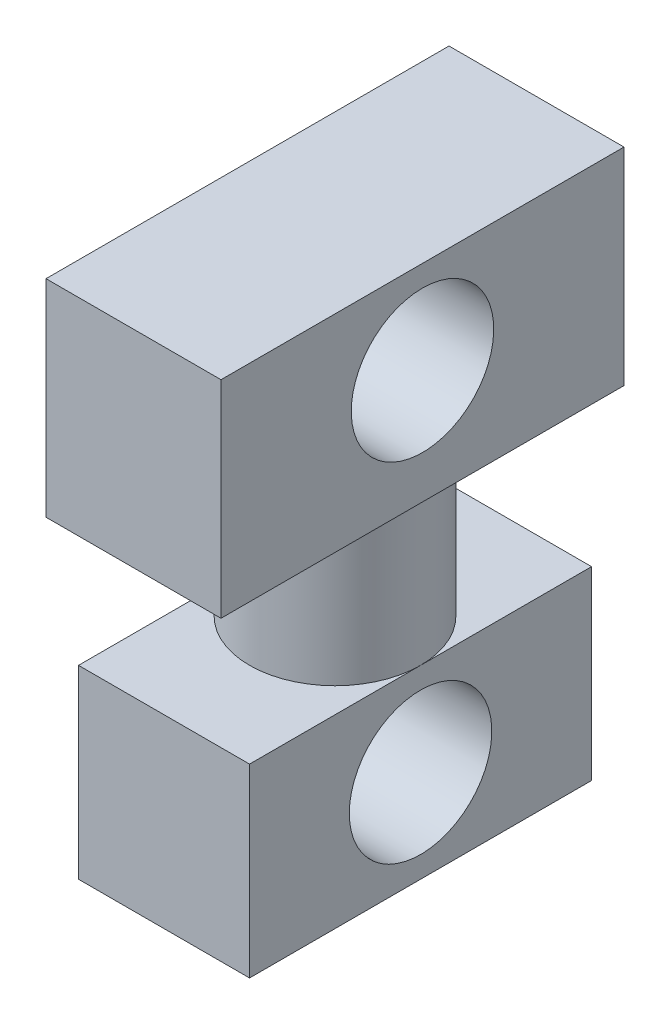
ISO-10303-21;
HEADER;
FILE_DESCRIPTION(('STEP AP214'),'2;1');
FILE_NAME('part.step','',(''),(''),'','','');
FILE_SCHEMA(('AUTOMOTIVE_DESIGN { 1 0 10303 214 1 1 1 1 }'));
ENDSEC;
DATA;
#1=APPLICATION_CONTEXT('core data for automotive mechanical design processes');
#2=APPLICATION_PROTOCOL_DEFINITION('international standard','automotive_design',2000,#1);
#3=PRODUCT_CONTEXT('',#1,'mechanical');
#4=PRODUCT('Part','Part','',(#3));
#5=PRODUCT_RELATED_PRODUCT_CATEGORY('part','',(#4));
#6=PRODUCT_DEFINITION_FORMATION('','',#4);
#7=PRODUCT_DEFINITION_CONTEXT('part definition',#1,'design');
#8=PRODUCT_DEFINITION('design','',#6,#7);
#9=PRODUCT_DEFINITION_SHAPE('','',#8);
#10=(LENGTH_UNIT() NAMED_UNIT(*) SI_UNIT(.MILLI.,.METRE.));
#11=(NAMED_UNIT(*) PLANE_ANGLE_UNIT() SI_UNIT($,.RADIAN.));
#12=(NAMED_UNIT(*) SI_UNIT($,.STERADIAN.) SOLID_ANGLE_UNIT());
#13=UNCERTAINTY_MEASURE_WITH_UNIT(LENGTH_MEASURE(1.E-05),#10,'distance_accuracy_value','');
#14=(GEOMETRIC_REPRESENTATION_CONTEXT(3) GLOBAL_UNCERTAINTY_ASSIGNED_CONTEXT((#13)) GLOBAL_UNIT_ASSIGNED_CONTEXT((#10,
#11,#12)) REPRESENTATION_CONTEXT('',''));
#15=CARTESIAN_POINT('',(0.,0.,0.));
#16=DIRECTION('',(0.,0.,1.));
#17=DIRECTION('',(1.,0.,0.));
#18=AXIS2_PLACEMENT_3D('',#15,#16,#17);
#19=CARTESIAN_POINT('',(0.,20.7362745098039,28.28));
#20=DIRECTION('',(1.,0.,0.));
#21=DIRECTION('',(0.,0.,-1.));
#22=AXIS2_PLACEMENT_3D('',#19,#20,#21);
#23=PLANE('',#22);
#24=CARTESIAN_POINT('',(0.,28.7362745098039,14.14));
#25=DIRECTION('',(1.,0.,0.));
#26=DIRECTION('',(0.,0.,-1.));
#27=AXIS2_PLACEMENT_3D('',#24,#25,#26);
#28=CIRCLE('',#27,5.);
#29=CARTESIAN_POINT('',(0.,28.7362745098039,9.14));
#30=VERTEX_POINT('',#29);
#31=EDGE_CURVE('E189',#30,#30,#28,.T.);
#32=ORIENTED_EDGE('',*,*,#31,.T.);
#33=EDGE_LOOP('',(#32));
#34=FACE_BOUND('',#33,.T.);
#35=DIRECTION('',(0.,-1.,0.));
#36=VECTOR('',#35,1.);
#37=CARTESIAN_POINT('',(0.,20.7362745098039,0.));
#38=LINE('',#37,#36);
#39=CARTESIAN_POINT('',(0.,35.2362745098039,0.));
#40=VERTEX_POINT('',#39);
#41=CARTESIAN_POINT('',(0.,20.7362745098039,0.));
#42=VERTEX_POINT('',#41);
#43=EDGE_CURVE('E193',#40,#42,#38,.T.);
#44=ORIENTED_EDGE('',*,*,#43,.T.);
#45=DIRECTION('',(0.,0.,-1.));
#46=VECTOR('',#45,1.);
#47=CARTESIAN_POINT('',(0.,20.7362745098039,28.28));
#48=LINE('',#47,#46);
#49=CARTESIAN_POINT('',(0.,20.7362745098039,28.28));
#50=VERTEX_POINT('',#49);
#51=EDGE_CURVE('E53',#50,#42,#48,.T.);
#52=ORIENTED_EDGE('',*,*,#51,.F.);
#53=DIRECTION('',(0.,-1.,0.));
#54=VECTOR('',#53,1.);
#55=CARTESIAN_POINT('',(0.,20.7362745098039,28.28));
#56=LINE('',#55,#54);
#57=CARTESIAN_POINT('',(0.,35.2362745098039,28.28));
#58=VERTEX_POINT('',#57);
#59=EDGE_CURVE('E194',#58,#50,#56,.T.);
#60=ORIENTED_EDGE('',*,*,#59,.F.);
#61=DIRECTION('',(0.,0.,-1.));
#62=VECTOR('',#61,1.);
#63=CARTESIAN_POINT('',(0.,35.2362745098039,28.28));
#64=LINE('',#63,#62);
#65=EDGE_CURVE('E204',#58,#40,#64,.T.);
#66=ORIENTED_EDGE('',*,*,#65,.T.);
#67=EDGE_LOOP('',(#44,#52,#60,#66));
#68=FACE_BOUND('',#67,.T.);
#69=ADVANCED_FACE('F43',(#34,#68),#23,.F.);
#70=CARTESIAN_POINT('',(12.28,20.7362745098039,28.28));
#71=DIRECTION('',(0.,1.,0.));
#72=DIRECTION('',(0.,0.,1.));
#73=AXIS2_PLACEMENT_3D('',#70,#71,#72);
#74=PLANE('',#73);
#75=CARTESIAN_POINT('',(6.14,20.7362745098039,14.14));
#76=DIRECTION('',(0.,-1.,0.));
#77=DIRECTION('',(0.,0.,-1.));
#78=AXIS2_PLACEMENT_3D('',#75,#76,#77);
#79=CIRCLE('',#78,6.);
#80=CARTESIAN_POINT('',(6.14,20.7362745098039,8.14));
#81=VERTEX_POINT('',#80);
#82=EDGE_CURVE('E11',#81,#81,#79,.T.);
#83=ORIENTED_EDGE('',*,*,#82,.F.);
#84=EDGE_LOOP('',(#83));
#85=FACE_BOUND('',#84,.T.);
#86=DIRECTION('',(1.,0.,0.));
#87=VECTOR('',#86,1.);
#88=CARTESIAN_POINT('',(12.28,20.7362745098039,0.));
#89=LINE('',#88,#87);
#90=CARTESIAN_POINT('',(12.28,20.7362745098039,0.));
#91=VERTEX_POINT('',#90);
#92=EDGE_CURVE('E208',#42,#91,#89,.T.);
#93=ORIENTED_EDGE('',*,*,#92,.T.);
#94=DIRECTION('',(0.,0.,-1.));
#95=VECTOR('',#94,1.);
#96=CARTESIAN_POINT('',(12.28,20.7362745098039,28.28));
#97=LINE('',#96,#95);
#98=CARTESIAN_POINT('',(12.28,20.7362745098039,28.28));
#99=VERTEX_POINT('',#98);
#100=EDGE_CURVE('E220',#99,#91,#97,.T.);
#101=ORIENTED_EDGE('',*,*,#100,.F.);
#102=DIRECTION('',(1.,0.,0.));
#103=VECTOR('',#102,1.);
#104=CARTESIAN_POINT('',(12.28,20.7362745098039,28.28));
#105=LINE('',#104,#103);
#106=EDGE_CURVE('E94',#50,#99,#105,.T.);
#107=ORIENTED_EDGE('',*,*,#106,.F.);
#108=ORIENTED_EDGE('',*,*,#51,.T.);
#109=EDGE_LOOP('',(#93,#101,#107,#108));
#110=FACE_BOUND('',#109,.T.);
#111=ADVANCED_FACE('F224',(#85,#110),#74,.F.);
#112=CARTESIAN_POINT('',(12.28,35.2362745098039,28.28));
#113=DIRECTION('',(-1.,0.,0.));
#114=DIRECTION('',(0.,-1.,0.));
#115=AXIS2_PLACEMENT_3D('',#112,#113,#114);
#116=PLANE('',#115);
#117=CARTESIAN_POINT('',(12.28,28.7362745098039,14.14));
#118=DIRECTION('',(1.,0.,0.));
#119=DIRECTION('',(0.,1.,0.));
#120=AXIS2_PLACEMENT_3D('',#117,#118,#119);
#121=CIRCLE('',#120,5.);
#122=CARTESIAN_POINT('',(12.28,33.7362745098039,14.14));
#123=VERTEX_POINT('',#122);
#124=EDGE_CURVE('E184',#123,#123,#121,.T.);
#125=ORIENTED_EDGE('',*,*,#124,.F.);
#126=EDGE_LOOP('',(#125));
#127=FACE_BOUND('',#126,.T.);
#128=DIRECTION('',(0.,1.,0.));
#129=VECTOR('',#128,1.);
#130=CARTESIAN_POINT('',(12.28,35.2362745098039,0.));
#131=LINE('',#130,#129);
#132=CARTESIAN_POINT('',(12.28,35.2362745098039,0.));
#133=VERTEX_POINT('',#132);
#134=EDGE_CURVE('E80',#91,#133,#131,.T.);
#135=ORIENTED_EDGE('',*,*,#134,.T.);
#136=DIRECTION('',(0.,0.,-1.));
#137=VECTOR('',#136,1.);
#138=CARTESIAN_POINT('',(12.28,35.2362745098039,28.28));
#139=LINE('',#138,#137);
#140=CARTESIAN_POINT('',(12.28,35.2362745098039,28.28));
#141=VERTEX_POINT('',#140);
#142=EDGE_CURVE('E217',#141,#133,#139,.T.);
#143=ORIENTED_EDGE('',*,*,#142,.F.);
#144=DIRECTION('',(0.,1.,0.));
#145=VECTOR('',#144,1.);
#146=CARTESIAN_POINT('',(12.28,35.2362745098039,28.28));
#147=LINE('',#146,#145);
#148=EDGE_CURVE('E199',#99,#141,#147,.T.);
#149=ORIENTED_EDGE('',*,*,#148,.F.);
#150=ORIENTED_EDGE('',*,*,#100,.T.);
#151=EDGE_LOOP('',(#135,#143,#149,#150));
#152=FACE_BOUND('',#151,.T.);
#153=ADVANCED_FACE('F249',(#127,#152),#116,.F.);
#154=CARTESIAN_POINT('',(0.,35.2362745098039,28.28));
#155=DIRECTION('',(0.,-1.,0.));
#156=DIRECTION('',(0.,0.,-1.));
#157=AXIS2_PLACEMENT_3D('',#154,#155,#156);
#158=PLANE('',#157);
#159=DIRECTION('',(-1.,0.,0.));
#160=VECTOR('',#159,1.);
#161=CARTESIAN_POINT('',(0.,35.2362745098039,0.));
#162=LINE('',#161,#160);
#163=EDGE_CURVE('E86',#133,#40,#162,.T.);
#164=ORIENTED_EDGE('',*,*,#163,.T.);
#165=ORIENTED_EDGE('',*,*,#65,.F.);
#166=DIRECTION('',(-1.,0.,0.));
#167=VECTOR('',#166,1.);
#168=CARTESIAN_POINT('',(0.,35.2362745098039,28.28));
#169=LINE('',#168,#167);
#170=EDGE_CURVE('E62',#141,#58,#169,.T.);
#171=ORIENTED_EDGE('',*,*,#170,.F.);
#172=ORIENTED_EDGE('',*,*,#142,.T.);
#173=EDGE_LOOP('',(#164,#165,#171,#172));
#174=FACE_BOUND('',#173,.T.);
#175=ADVANCED_FACE('F241',(#174),#158,.F.);
#176=CARTESIAN_POINT('',(0.,0.,28.28));
#177=DIRECTION('',(0.,0.,-1.));
#178=DIRECTION('',(-1.,0.,0.));
#179=AXIS2_PLACEMENT_3D('',#176,#177,#178);
#180=PLANE('',#179);
#181=ORIENTED_EDGE('',*,*,#59,.T.);
#182=ORIENTED_EDGE('',*,*,#106,.T.);
#183=ORIENTED_EDGE('',*,*,#148,.T.);
#184=ORIENTED_EDGE('',*,*,#170,.T.);
#185=EDGE_LOOP('',(#181,#182,#183,#184));
#186=FACE_BOUND('',#185,.T.);
#187=ADVANCED_FACE('F232',(#186),#180,.F.);
#188=CARTESIAN_POINT('',(0.,0.,0.));
#189=DIRECTION('',(0.,0.,-1.));
#190=DIRECTION('',(-1.,0.,0.));
#191=AXIS2_PLACEMENT_3D('',#188,#189,#190);
#192=PLANE('',#191);
#193=ORIENTED_EDGE('',*,*,#43,.F.);
#194=ORIENTED_EDGE('',*,*,#163,.F.);
#195=ORIENTED_EDGE('',*,*,#134,.F.);
#196=ORIENTED_EDGE('',*,*,#92,.F.);
#197=EDGE_LOOP('',(#193,#194,#195,#196));
#198=FACE_BOUND('',#197,.T.);
#199=ADVANCED_FACE('F229',(#198),#192,.T.);
#200=CARTESIAN_POINT('',(-15.99,28.7362745098039,14.14));
#201=DIRECTION('',(1.,0.,0.));
#202=DIRECTION('',(0.,1.,0.));
#203=AXIS2_PLACEMENT_3D('',#200,#201,#202);
#204=CYLINDRICAL_SURFACE('',#203,5.);
#205=ORIENTED_EDGE('',*,*,#124,.T.);
#206=EDGE_LOOP('',(#205));
#207=FACE_BOUND('',#206,.T.);
#208=ORIENTED_EDGE('',*,*,#31,.F.);
#209=EDGE_LOOP('',(#208));
#210=FACE_BOUND('',#209,.T.);
#211=ADVANCED_FACE('F231',(#207,#210),#204,.F.);
#212=CARTESIAN_POINT('',(6.14,10.7362745098039,14.14));
#213=DIRECTION('',(0.,1.,0.));
#214=DIRECTION('',(0.,0.,1.));
#215=AXIS2_PLACEMENT_3D('',#212,#213,#214);
#216=CYLINDRICAL_SURFACE('',#215,6.);
#217=CARTESIAN_POINT('',(6.14,10.7362745098039,14.14));
#218=DIRECTION('',(0.,-1.,0.));
#219=DIRECTION('',(0.,0.,-1.));
#220=AXIS2_PLACEMENT_3D('',#217,#218,#219);
#221=CIRCLE('',#220,6.);
#222=CARTESIAN_POINT('',(0.139999999999999,10.7362745098039,14.14));
#223=VERTEX_POINT('',#222);
#224=EDGE_CURVE('E135',#223,#223,#221,.T.);
#225=ORIENTED_EDGE('',*,*,#224,.F.);
#226=EDGE_LOOP('',(#225));
#227=FACE_BOUND('',#226,.T.);
#228=ORIENTED_EDGE('',*,*,#82,.T.);
#229=EDGE_LOOP('',(#228));
#230=FACE_BOUND('',#229,.T.);
#231=ADVANCED_FACE('F238',(#227,#230),#216,.T.);
#232=CARTESIAN_POINT('',(0.,10.7362745098039,0.));
#233=DIRECTION('',(0.,-1.,0.));
#234=DIRECTION('',(0.,0.,-1.));
#235=AXIS2_PLACEMENT_3D('',#232,#233,#234);
#236=PLANE('',#235);
#237=DIRECTION('',(0.,0.,1.));
#238=VECTOR('',#237,1.);
#239=CARTESIAN_POINT('',(0.139999999999999,10.7362745098039,0.));
#240=LINE('',#239,#238);
#241=CARTESIAN_POINT('',(0.140000000000001,10.7362745098039,2.14));
#242=VERTEX_POINT('',#241);
#243=EDGE_CURVE('E164',#242,#223,#240,.T.);
#244=ORIENTED_EDGE('',*,*,#243,.T.);
#245=ORIENTED_EDGE('',*,*,#224,.T.);
#246=CARTESIAN_POINT('',(0.139999999999999,10.7362745098039,26.14));
#247=VERTEX_POINT('',#246);
#248=EDGE_CURVE('E163',#223,#247,#240,.T.);
#249=ORIENTED_EDGE('',*,*,#248,.T.);
#250=DIRECTION('',(1.,0.,0.));
#251=VECTOR('',#250,1.);
#252=CARTESIAN_POINT('',(0.,10.7362745098039,26.14));
#253=LINE('',#252,#251);
#254=CARTESIAN_POINT('',(12.1431950844714,10.7362745098039,26.14));
#255=VERTEX_POINT('',#254);
#256=EDGE_CURVE('E130',#247,#255,#253,.T.);
#257=ORIENTED_EDGE('',*,*,#256,.T.);
#258=DIRECTION('',(0.,0.,1.));
#259=VECTOR('',#258,1.);
#260=CARTESIAN_POINT('',(12.1431950844714,10.7362745098039,0.));
#261=LINE('',#260,#259);
#262=CARTESIAN_POINT('',(12.1431950844714,10.7362745098039,2.14));
#263=VERTEX_POINT('',#262);
#264=EDGE_CURVE('E146',#263,#255,#261,.T.);
#265=ORIENTED_EDGE('',*,*,#264,.F.);
#266=DIRECTION('',(1.,0.,0.));
#267=VECTOR('',#266,1.);
#268=CARTESIAN_POINT('',(0.,10.7362745098039,2.14));
#269=LINE('',#268,#267);
#270=EDGE_CURVE('E168',#242,#263,#269,.T.);
#271=ORIENTED_EDGE('',*,*,#270,.F.);
#272=EDGE_LOOP('',(#244,#245,#249,#257,#265,#271));
#273=FACE_BOUND('',#272,.T.);
#274=ADVANCED_FACE('F299',(#273),#236,.F.);
#275=CARTESIAN_POINT('',(0.,-2.26372549019608,26.14));
#276=DIRECTION('',(0.,0.,1.));
#277=DIRECTION('',(1.,0.,0.));
#278=AXIS2_PLACEMENT_3D('',#275,#276,#277);
#279=PLANE('',#278);
#280=ORIENTED_EDGE('',*,*,#256,.F.);
#281=DIRECTION('',(0.,1.,0.));
#282=VECTOR('',#281,1.);
#283=CARTESIAN_POINT('',(0.139999999999999,-2.26372549019608,26.14));
#284=LINE('',#283,#282);
#285=CARTESIAN_POINT('',(0.139999999999999,-2.26372549019608,26.14));
#286=VERTEX_POINT('',#285);
#287=EDGE_CURVE('E125',#286,#247,#284,.T.);
#288=ORIENTED_EDGE('',*,*,#287,.F.);
#289=DIRECTION('',(1.,0.,0.));
#290=VECTOR('',#289,1.);
#291=CARTESIAN_POINT('',(0.,-2.26372549019608,26.14));
#292=LINE('',#291,#290);
#293=CARTESIAN_POINT('',(12.1431950844714,-2.26372549019608,26.14));
#294=VERTEX_POINT('',#293);
#295=EDGE_CURVE('E128',#286,#294,#292,.T.);
#296=ORIENTED_EDGE('',*,*,#295,.T.);
#297=DIRECTION('',(0.,1.,0.));
#298=VECTOR('',#297,1.);
#299=CARTESIAN_POINT('',(12.1431950844714,-2.26372549019608,26.14));
#300=LINE('',#299,#298);
#301=EDGE_CURVE('E160',#294,#255,#300,.T.);
#302=ORIENTED_EDGE('',*,*,#301,.T.);
#303=EDGE_LOOP('',(#280,#288,#296,#302));
#304=FACE_BOUND('',#303,.T.);
#305=ADVANCED_FACE('F127',(#304),#279,.T.);
#306=CARTESIAN_POINT('',(0.139999999999999,-2.26372549019608,0.));
#307=DIRECTION('',(-1.,0.,0.));
#308=DIRECTION('',(0.,0.,1.));
#309=AXIS2_PLACEMENT_3D('',#306,#307,#308);
#310=PLANE('',#309);
#311=CARTESIAN_POINT('',(0.139999999999999,4.23627450980392,14.14));
#312=DIRECTION('',(-1.,0.,0.));
#313=DIRECTION('',(0.,0.,1.));
#314=AXIS2_PLACEMENT_3D('',#311,#312,#313);
#315=CIRCLE('',#314,5.);
#316=CARTESIAN_POINT('',(0.14,4.23627450980392,19.14));
#317=VERTEX_POINT('',#316);
#318=EDGE_CURVE('E374',#317,#317,#315,.T.);
#319=ORIENTED_EDGE('',*,*,#318,.F.);
#320=EDGE_LOOP('',(#319));
#321=FACE_BOUND('',#320,.T.);
#322=ORIENTED_EDGE('',*,*,#243,.F.);
#323=DIRECTION('',(0.,1.,0.));
#324=VECTOR('',#323,1.);
#325=CARTESIAN_POINT('',(0.140000000000001,-2.26372549019608,2.14));
#326=LINE('',#325,#324);
#327=CARTESIAN_POINT('',(0.140000000000001,-2.26372549019608,2.14));
#328=VERTEX_POINT('',#327);
#329=EDGE_CURVE('E136',#328,#242,#326,.T.);
#330=ORIENTED_EDGE('',*,*,#329,.F.);
#331=DIRECTION('',(0.,0.,1.));
#332=VECTOR('',#331,1.);
#333=CARTESIAN_POINT('',(0.139999999999999,-2.26372549019608,0.));
#334=LINE('',#333,#332);
#335=EDGE_CURVE('E141',#328,#286,#334,.T.);
#336=ORIENTED_EDGE('',*,*,#335,.T.);
#337=ORIENTED_EDGE('',*,*,#287,.T.);
#338=ORIENTED_EDGE('',*,*,#248,.F.);
#339=EDGE_LOOP('',(#322,#330,#336,#337,#338));
#340=FACE_BOUND('',#339,.T.);
#341=ADVANCED_FACE('F149',(#321,#340),#310,.T.);
#342=CARTESIAN_POINT('',(0.,-2.26372549019608,2.14));
#343=DIRECTION('',(0.,0.,1.));
#344=DIRECTION('',(1.,0.,0.));
#345=AXIS2_PLACEMENT_3D('',#342,#343,#344);
#346=PLANE('',#345);
#347=ORIENTED_EDGE('',*,*,#270,.T.);
#348=DIRECTION('',(0.,1.,0.));
#349=VECTOR('',#348,1.);
#350=CARTESIAN_POINT('',(12.1431950844714,-2.26372549019608,2.14));
#351=LINE('',#350,#349);
#352=CARTESIAN_POINT('',(12.1431950844714,-2.26372549019608,2.14));
#353=VERTEX_POINT('',#352);
#354=EDGE_CURVE('E176',#353,#263,#351,.T.);
#355=ORIENTED_EDGE('',*,*,#354,.F.);
#356=DIRECTION('',(1.,0.,0.));
#357=VECTOR('',#356,1.);
#358=CARTESIAN_POINT('',(0.,-2.26372549019608,2.14));
#359=LINE('',#358,#357);
#360=EDGE_CURVE('E152',#328,#353,#359,.T.);
#361=ORIENTED_EDGE('',*,*,#360,.F.);
#362=ORIENTED_EDGE('',*,*,#329,.T.);
#363=EDGE_LOOP('',(#347,#355,#361,#362));
#364=FACE_BOUND('',#363,.T.);
#365=ADVANCED_FACE('F326',(#364),#346,.F.);
#366=CARTESIAN_POINT('',(12.1431950844714,-2.26372549019608,0.));
#367=DIRECTION('',(-1.,0.,0.));
#368=DIRECTION('',(0.,0.,1.));
#369=AXIS2_PLACEMENT_3D('',#366,#367,#368);
#370=PLANE('',#369);
#371=CARTESIAN_POINT('',(12.1431950844714,4.23627450980392,14.14));
#372=DIRECTION('',(-1.,0.,0.));
#373=DIRECTION('',(0.,0.,1.));
#374=AXIS2_PLACEMENT_3D('',#371,#372,#373);
#375=CIRCLE('',#374,5.);
#376=CARTESIAN_POINT('',(12.1431950844714,4.23627450980392,19.14));
#377=VERTEX_POINT('',#376);
#378=EDGE_CURVE('E46',#377,#377,#375,.T.);
#379=ORIENTED_EDGE('',*,*,#378,.T.);
#380=EDGE_LOOP('',(#379));
#381=FACE_BOUND('',#380,.T.);
#382=ORIENTED_EDGE('',*,*,#264,.T.);
#383=ORIENTED_EDGE('',*,*,#301,.F.);
#384=DIRECTION('',(0.,0.,1.));
#385=VECTOR('',#384,1.);
#386=CARTESIAN_POINT('',(12.1431950844714,-2.26372549019608,0.));
#387=LINE('',#386,#385);
#388=EDGE_CURVE('E143',#353,#294,#387,.T.);
#389=ORIENTED_EDGE('',*,*,#388,.F.);
#390=ORIENTED_EDGE('',*,*,#354,.T.);
#391=EDGE_LOOP('',(#382,#383,#389,#390));
#392=FACE_BOUND('',#391,.T.);
#393=ADVANCED_FACE('F331',(#381,#392),#370,.F.);
#394=CARTESIAN_POINT('',(0.,-2.26372549019608,0.));
#395=DIRECTION('',(0.,-1.,0.));
#396=DIRECTION('',(0.,0.,-1.));
#397=AXIS2_PLACEMENT_3D('',#394,#395,#396);
#398=PLANE('',#397);
#399=ORIENTED_EDGE('',*,*,#295,.F.);
#400=ORIENTED_EDGE('',*,*,#335,.F.);
#401=ORIENTED_EDGE('',*,*,#360,.T.);
#402=ORIENTED_EDGE('',*,*,#388,.T.);
#403=EDGE_LOOP('',(#399,#400,#401,#402));
#404=FACE_BOUND('',#403,.T.);
#405=ADVANCED_FACE('F140',(#404),#398,.T.);
#406=CARTESIAN_POINT('',(13.14,4.23627450980392,14.14));
#407=DIRECTION('',(-1.,0.,0.));
#408=DIRECTION('',(0.,0.,1.));
#409=AXIS2_PLACEMENT_3D('',#406,#407,#408);
#410=CYLINDRICAL_SURFACE('',#409,5.);
#411=CARTESIAN_POINT('',(0.14,4.23627450980392,19.14));
#412=CARTESIAN_POINT('',(0.26503328212991,4.23627450980392,19.14));
#413=CARTESIAN_POINT('',(0.39006656425982,4.23627450980392,19.14));
#414=CARTESIAN_POINT('',(0.640133128519641,4.23627450980392,19.14));
#415=CARTESIAN_POINT('',(0.765166410649551,4.23627450980392,19.14));
#416=CARTESIAN_POINT('',(1.01523297490937,4.23627450980392,19.14));
#417=CARTESIAN_POINT('',(1.14026625703928,4.23627450980392,19.14));
#418=CARTESIAN_POINT('',(1.39033282129911,4.23627450980392,19.14));
#419=CARTESIAN_POINT('',(1.51536610342902,4.23627450980392,19.14));
#420=CARTESIAN_POINT('',(1.76543266768884,4.23627450980392,19.14));
#421=CARTESIAN_POINT('',(1.89046594981875,4.23627450980392,19.14));
#422=CARTESIAN_POINT('',(2.14053251407857,4.23627450980392,19.14));
#423=CARTESIAN_POINT('',(2.26556579620848,4.23627450980392,19.14));
#424=CARTESIAN_POINT('',(2.5156323604683,4.23627450980392,19.14));
#425=CARTESIAN_POINT('',(2.64066564259821,4.23627450980392,19.14));
#426=CARTESIAN_POINT('',(2.89073220685803,4.23627450980392,19.14));
#427=CARTESIAN_POINT('',(3.01576548898794,4.23627450980392,19.14));
#428=CARTESIAN_POINT('',(3.26583205324776,4.23627450980392,19.14));
#429=CARTESIAN_POINT('',(3.39086533537767,4.23627450980392,19.14));
#430=CARTESIAN_POINT('',(3.64093189963749,4.23627450980392,19.14));
#431=CARTESIAN_POINT('',(3.7659651817674,4.23627450980392,19.14));
#432=CARTESIAN_POINT('',(4.01603174602722,4.23627450980392,19.14));
#433=CARTESIAN_POINT('',(4.14106502815714,4.23627450980392,19.14));
#434=CARTESIAN_POINT('',(4.39113159241696,4.23627450980392,19.14));
#435=CARTESIAN_POINT('',(4.51616487454687,4.23627450980392,19.14));
#436=CARTESIAN_POINT('',(4.76623143880669,4.23627450980392,19.14));
#437=CARTESIAN_POINT('',(4.8912647209366,4.23627450980392,19.14));
#438=CARTESIAN_POINT('',(5.14133128519642,4.23627450980392,19.14));
#439=CARTESIAN_POINT('',(5.26636456732633,4.23627450980392,19.14));
#440=CARTESIAN_POINT('',(5.51643113158615,4.23627450980392,19.14));
#441=CARTESIAN_POINT('',(5.64146441371606,4.23627450980392,19.14));
#442=CARTESIAN_POINT('',(5.89153097797588,4.23627450980392,19.14));
#443=CARTESIAN_POINT('',(6.01656426010579,4.23627450980392,19.14));
#444=CARTESIAN_POINT('',(6.26663082436561,4.23627450980392,19.14));
#445=CARTESIAN_POINT('',(6.39166410649552,4.23627450980392,19.14));
#446=CARTESIAN_POINT('',(6.64173067075534,4.23627450980392,19.14));
#447=CARTESIAN_POINT('',(6.76676395288526,4.23627450980392,19.14));
#448=CARTESIAN_POINT('',(7.01683051714508,4.23627450980392,19.14));
#449=CARTESIAN_POINT('',(7.14186379927499,4.23627450980392,19.14));
#450=CARTESIAN_POINT('',(7.39193036353481,4.23627450980392,19.14));
#451=CARTESIAN_POINT('',(7.51696364566472,4.23627450980392,19.14));
#452=CARTESIAN_POINT('',(7.76703020992454,4.23627450980392,19.14));
#453=CARTESIAN_POINT('',(7.89206349205445,4.23627450980392,19.14));
#454=CARTESIAN_POINT('',(8.14213005631427,4.23627450980392,19.14));
#455=CARTESIAN_POINT('',(8.26716333844418,4.23627450980392,19.14));
#456=CARTESIAN_POINT('',(8.517229902704,4.23627450980392,19.14));
#457=CARTESIAN_POINT('',(8.64226318483391,4.23627450980392,19.14));
#458=CARTESIAN_POINT('',(8.89232974909373,4.23627450980392,19.14));
#459=CARTESIAN_POINT('',(9.01736303122364,4.23627450980392,19.14));
#460=CARTESIAN_POINT('',(9.26742959548347,4.23627450980392,19.14));
#461=CARTESIAN_POINT('',(9.39246287761338,4.23627450980392,19.14));
#462=CARTESIAN_POINT('',(9.6425294418732,4.23627450980392,19.14));
#463=CARTESIAN_POINT('',(9.76756272400311,4.23627450980392,19.14));
#464=CARTESIAN_POINT('',(10.0176292882629,4.23627450980392,19.14));
#465=CARTESIAN_POINT('',(10.1426625703928,4.23627450980392,19.14));
#466=CARTESIAN_POINT('',(10.3927291346527,4.23627450980392,19.14));
#467=CARTESIAN_POINT('',(10.5177624167826,4.23627450980392,19.14));
#468=CARTESIAN_POINT('',(10.7678289810424,4.23627450980392,19.14));
#469=CARTESIAN_POINT('',(10.8928622631723,4.23627450980392,19.14));
#470=CARTESIAN_POINT('',(11.1429288274321,4.23627450980392,19.14));
#471=CARTESIAN_POINT('',(11.267962109562,4.23627450980392,19.14));
#472=CARTESIAN_POINT('',(11.5180286738219,4.23627450980392,19.14));
#473=CARTESIAN_POINT('',(11.6430619559518,4.23627450980392,19.14));
#474=CARTESIAN_POINT('',(11.8931285202116,4.23627450980392,19.14));
#475=CARTESIAN_POINT('',(12.0181618023415,4.23627450980392,19.14));
#476=CARTESIAN_POINT('',(12.1431950844714,4.23627450980392,19.14));
#477=B_SPLINE_CURVE_WITH_KNOTS('',3,(#411,#412,#413,#414,#415,#416,#417,#418,#419,#420,#421,
#422,#423,#424,#425,#426,#427,#428,#429,#430,#431,#432,#433,#434,#435,#436,#437,#438,#439,#440,
#441,#442,#443,#444,#445,#446,#447,#448,#449,#450,#451,#452,#453,#454,#455,#456,#457,#458,#459,
#460,#461,#462,#463,#464,#465,#466,#467,#468,#469,#470,#471,#472,#473,#474,#475,#476),
.UNSPECIFIED.,.F.,.F.,(4,2,2,2,2,2,2,2,2,2,2,2,2,2,2,2,2,2,2,2,2,2,2,2,2,2,2,2,2,2,2,2,4),(0.,
0.375099846389731,0.750199692779462,1.1252995391692,1.50039938555893,1.87549923194866,
2.25059907833839,2.62569892472812,3.00079877111785,3.37589861750758,3.75099846389731,
4.12609831028705,4.50119815667678,4.87629800306651,5.25139784945624,5.62649769584597,
6.0015975422357,6.37669738862543,6.75179723501517,7.1268970814049,7.50199692779463,
7.87709677418436,8.25219662057409,8.62729646696382,9.00239631335356,9.37749615974329,
9.75259600613302,10.1276958525227,10.5027956989125,10.8778955453022,11.2529953916919,
11.6280952380817,12.0031950844714),.UNSPECIFIED.);
#478=EDGE_CURVE('BSEAM344',#317,#377,#477,.T.);
#479=ORIENTED_EDGE('',*,*,#318,.T.);
#480=ORIENTED_EDGE('',*,*,#378,.F.);
#481=ORIENTED_EDGE('',*,*,#478,.T.);
#482=ORIENTED_EDGE('',*,*,#478,.F.);
#483=EDGE_LOOP('',(#479,#481,#480,#482));
#484=FACE_BOUND('',#483,.T.);
#485=ADVANCED_FACE('F344',(#484),#410,.F.);
#486=CLOSED_SHELL('',(#69,#111,#153,#175,#187,#199,#211,#231,#274,#305,#341,#365,#393,#405,#485));
#487=MANIFOLD_SOLID_BREP('B2',#486);
#488=ADVANCED_BREP_SHAPE_REPRESENTATION('',(#18,#487),#14);
#489=SHAPE_DEFINITION_REPRESENTATION(#9,#488);
ENDSEC;
END-ISO-10303-21;
